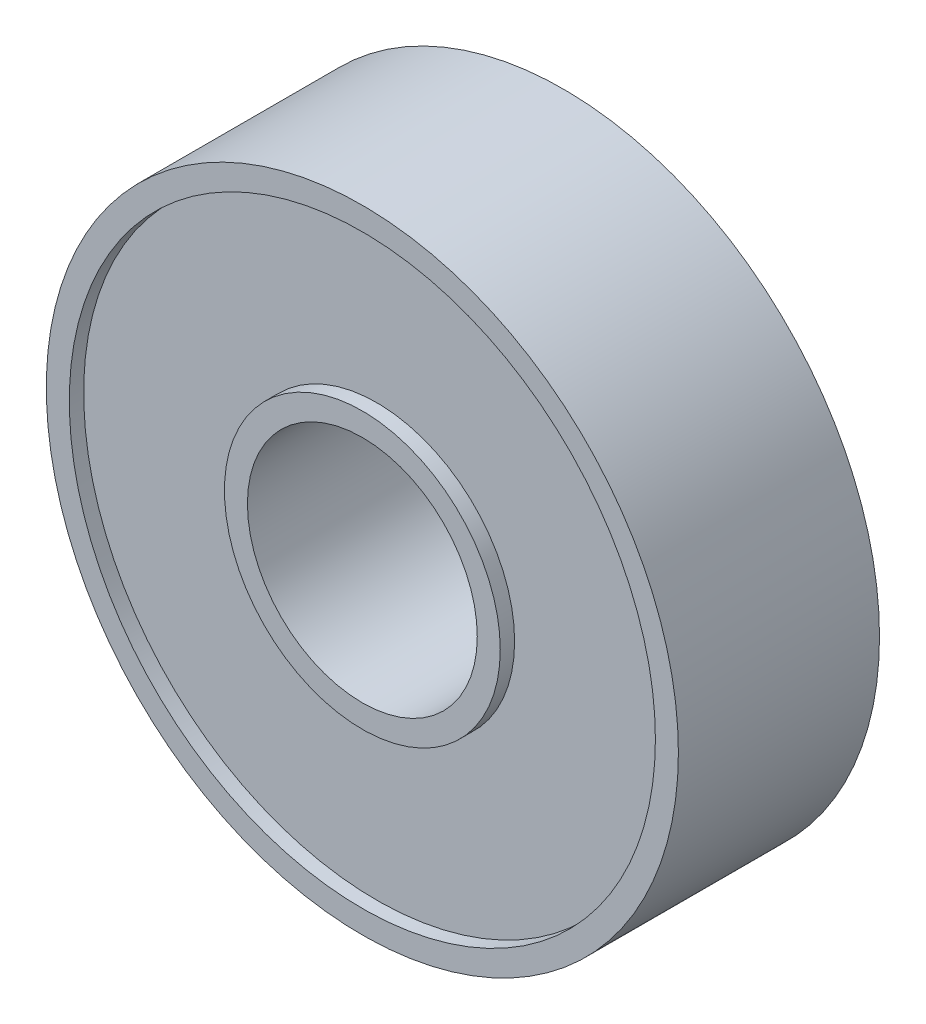
ISO-10303-21;
HEADER;
FILE_DESCRIPTION(('STEP AP214'),'2;1');
FILE_NAME('part.step','',(''),(''),'','','');
FILE_SCHEMA(('AUTOMOTIVE_DESIGN { 1 0 10303 214 1 1 1 1 }'));
ENDSEC;
DATA;
#1=APPLICATION_CONTEXT('core data for automotive mechanical design processes');
#2=APPLICATION_PROTOCOL_DEFINITION('international standard','automotive_design',2000,#1);
#3=PRODUCT_CONTEXT('',#1,'mechanical');
#4=PRODUCT('Part','Part','',(#3));
#5=PRODUCT_RELATED_PRODUCT_CATEGORY('part','',(#4));
#6=PRODUCT_DEFINITION_FORMATION('','',#4);
#7=PRODUCT_DEFINITION_CONTEXT('part definition',#1,'design');
#8=PRODUCT_DEFINITION('design','',#6,#7);
#9=PRODUCT_DEFINITION_SHAPE('','',#8);
#10=(LENGTH_UNIT() NAMED_UNIT(*) SI_UNIT(.MILLI.,.METRE.));
#11=(NAMED_UNIT(*) PLANE_ANGLE_UNIT() SI_UNIT($,.RADIAN.));
#12=(NAMED_UNIT(*) SI_UNIT($,.STERADIAN.) SOLID_ANGLE_UNIT());
#13=UNCERTAINTY_MEASURE_WITH_UNIT(LENGTH_MEASURE(1.E-05),#10,'distance_accuracy_value','');
#14=(GEOMETRIC_REPRESENTATION_CONTEXT(3) GLOBAL_UNCERTAINTY_ASSIGNED_CONTEXT((#13)) GLOBAL_UNIT_ASSIGNED_CONTEXT((#10,
#11,#12)) REPRESENTATION_CONTEXT('',''));
#15=CARTESIAN_POINT('',(0.,0.,0.));
#16=DIRECTION('',(0.,0.,1.));
#17=DIRECTION('',(1.,0.,0.));
#18=AXIS2_PLACEMENT_3D('',#15,#16,#17);
#19=CARTESIAN_POINT('',(0.,0.,4.53807108026857));
#20=DIRECTION('',(0.,0.,1.));
#21=DIRECTION('',(1.,0.,0.));
#22=AXIS2_PLACEMENT_3D('',#19,#20,#21);
#23=CYLINDRICAL_SURFACE('',#22,4.8);
#24=CARTESIAN_POINT('',(0.,0.,3.5));
#25=DIRECTION('',(0.,0.,1.));
#26=DIRECTION('',(1.,0.,0.));
#27=AXIS2_PLACEMENT_3D('',#24,#25,#26);
#28=CIRCLE('',#27,4.8);
#29=CARTESIAN_POINT('',(4.8,0.,3.5));
#30=VERTEX_POINT('',#29);
#31=EDGE_CURVE('E10',#30,#30,#28,.T.);
#32=ORIENTED_EDGE('',*,*,#31,.F.);
#33=EDGE_LOOP('',(#32));
#34=FACE_BOUND('',#33,.T.);
#35=CARTESIAN_POINT('',(0.,0.,3.));
#36=DIRECTION('',(0.,0.,1.));
#37=DIRECTION('',(1.,0.,0.));
#38=AXIS2_PLACEMENT_3D('',#35,#36,#37);
#39=CIRCLE('',#38,4.8);
#40=CARTESIAN_POINT('',(4.8,0.,3.));
#41=VERTEX_POINT('',#40);
#42=EDGE_CURVE('E71',#41,#41,#39,.T.);
#43=ORIENTED_EDGE('',*,*,#42,.T.);
#44=EDGE_LOOP('',(#43));
#45=FACE_BOUND('',#44,.T.);
#46=ADVANCED_FACE('F31',(#34,#45),#23,.T.);
#47=CARTESIAN_POINT('',(0.,4.,3.5));
#48=DIRECTION('',(0.,0.,-1.));
#49=DIRECTION('',(-1.,0.,0.));
#50=AXIS2_PLACEMENT_3D('',#47,#48,#49);
#51=PLANE('',#50);
#52=CARTESIAN_POINT('',(0.,0.,3.5));
#53=DIRECTION('',(0.,0.,1.));
#54=DIRECTION('',(1.,0.,0.));
#55=AXIS2_PLACEMENT_3D('',#52,#53,#54);
#56=CIRCLE('',#55,4.);
#57=CARTESIAN_POINT('',(4.,0.,3.5));
#58=VERTEX_POINT('',#57);
#59=EDGE_CURVE('E37',#58,#58,#56,.T.);
#60=ORIENTED_EDGE('',*,*,#59,.F.);
#61=EDGE_LOOP('',(#60));
#62=FACE_BOUND('',#61,.T.);
#63=ORIENTED_EDGE('',*,*,#31,.T.);
#64=EDGE_LOOP('',(#63));
#65=FACE_BOUND('',#64,.T.);
#66=ADVANCED_FACE('F132',(#62,#65),#51,.F.);
#67=CARTESIAN_POINT('',(0.,0.,4.53807108026857));
#68=DIRECTION('',(0.,0.,1.));
#69=DIRECTION('',(1.,0.,0.));
#70=AXIS2_PLACEMENT_3D('',#67,#68,#69);
#71=CYLINDRICAL_SURFACE('',#70,4.);
#72=CARTESIAN_POINT('',(0.,0.,-3.5));
#73=DIRECTION('',(0.,0.,1.));
#74=DIRECTION('',(1.,0.,0.));
#75=AXIS2_PLACEMENT_3D('',#72,#73,#74);
#76=CIRCLE('',#75,4.);
#77=CARTESIAN_POINT('',(4.,0.,-3.5));
#78=VERTEX_POINT('',#77);
#79=EDGE_CURVE('E41',#78,#78,#76,.T.);
#80=ORIENTED_EDGE('',*,*,#79,.F.);
#81=EDGE_LOOP('',(#80));
#82=FACE_BOUND('',#81,.T.);
#83=ORIENTED_EDGE('',*,*,#59,.T.);
#84=EDGE_LOOP('',(#83));
#85=FACE_BOUND('',#84,.T.);
#86=ADVANCED_FACE('F127',(#82,#85),#71,.F.);
#87=CARTESIAN_POINT('',(0.,4.,-3.5));
#88=DIRECTION('',(0.,0.,1.));
#89=DIRECTION('',(1.,0.,0.));
#90=AXIS2_PLACEMENT_3D('',#87,#88,#89);
#91=PLANE('',#90);
#92=CARTESIAN_POINT('',(0.,0.,-3.5));
#93=DIRECTION('',(0.,0.,1.));
#94=DIRECTION('',(1.,0.,0.));
#95=AXIS2_PLACEMENT_3D('',#92,#93,#94);
#96=CIRCLE('',#95,4.8);
#97=CARTESIAN_POINT('',(4.8,0.,-3.5));
#98=VERTEX_POINT('',#97);
#99=EDGE_CURVE('E45',#98,#98,#96,.T.);
#100=ORIENTED_EDGE('',*,*,#99,.F.);
#101=EDGE_LOOP('',(#100));
#102=FACE_BOUND('',#101,.T.);
#103=ORIENTED_EDGE('',*,*,#79,.T.);
#104=EDGE_LOOP('',(#103));
#105=FACE_BOUND('',#104,.T.);
#106=ADVANCED_FACE('F121',(#102,#105),#91,.F.);
#107=CARTESIAN_POINT('',(0.,0.,4.53807108026857));
#108=DIRECTION('',(0.,0.,1.));
#109=DIRECTION('',(1.,0.,0.));
#110=AXIS2_PLACEMENT_3D('',#107,#108,#109);
#111=CYLINDRICAL_SURFACE('',#110,4.8);
#112=CARTESIAN_POINT('',(0.,0.,-3.));
#113=DIRECTION('',(0.,0.,1.));
#114=DIRECTION('',(1.,0.,0.));
#115=AXIS2_PLACEMENT_3D('',#112,#113,#114);
#116=CIRCLE('',#115,4.8);
#117=CARTESIAN_POINT('',(4.8,0.,-3.));
#118=VERTEX_POINT('',#117);
#119=EDGE_CURVE('E50',#118,#118,#116,.T.);
#120=ORIENTED_EDGE('',*,*,#119,.F.);
#121=EDGE_LOOP('',(#120));
#122=FACE_BOUND('',#121,.T.);
#123=ORIENTED_EDGE('',*,*,#99,.T.);
#124=EDGE_LOOP('',(#123));
#125=FACE_BOUND('',#124,.T.);
#126=ADVANCED_FACE('F115',(#122,#125),#111,.T.);
#127=CARTESIAN_POINT('',(0.,4.8,-3.));
#128=DIRECTION('',(0.,0.,1.));
#129=DIRECTION('',(1.,0.,0.));
#130=AXIS2_PLACEMENT_3D('',#127,#128,#129);
#131=PLANE('',#130);
#132=CARTESIAN_POINT('',(0.,0.,-3.));
#133=DIRECTION('',(0.,0.,1.));
#134=DIRECTION('',(1.,0.,0.));
#135=AXIS2_PLACEMENT_3D('',#132,#133,#134);
#136=CIRCLE('',#135,10.2);
#137=CARTESIAN_POINT('',(10.2,0.,-3.));
#138=VERTEX_POINT('',#137);
#139=EDGE_CURVE('E53',#138,#138,#136,.T.);
#140=ORIENTED_EDGE('',*,*,#139,.F.);
#141=EDGE_LOOP('',(#140));
#142=FACE_BOUND('',#141,.T.);
#143=ORIENTED_EDGE('',*,*,#119,.T.);
#144=EDGE_LOOP('',(#143));
#145=FACE_BOUND('',#144,.T.);
#146=ADVANCED_FACE('F109',(#142,#145),#131,.F.);
#147=CARTESIAN_POINT('',(0.,0.,4.53807108026857));
#148=DIRECTION('',(0.,0.,1.));
#149=DIRECTION('',(1.,0.,0.));
#150=AXIS2_PLACEMENT_3D('',#147,#148,#149);
#151=CYLINDRICAL_SURFACE('',#150,10.2);
#152=CARTESIAN_POINT('',(0.,0.,-3.5));
#153=DIRECTION('',(0.,0.,1.));
#154=DIRECTION('',(1.,0.,0.));
#155=AXIS2_PLACEMENT_3D('',#152,#153,#154);
#156=CIRCLE('',#155,10.2);
#157=CARTESIAN_POINT('',(10.2,0.,-3.5));
#158=VERTEX_POINT('',#157);
#159=EDGE_CURVE('E56',#158,#158,#156,.T.);
#160=ORIENTED_EDGE('',*,*,#159,.F.);
#161=EDGE_LOOP('',(#160));
#162=FACE_BOUND('',#161,.T.);
#163=ORIENTED_EDGE('',*,*,#139,.T.);
#164=EDGE_LOOP('',(#163));
#165=FACE_BOUND('',#164,.T.);
#166=ADVANCED_FACE('F103',(#162,#165),#151,.F.);
#167=CARTESIAN_POINT('',(0.,10.2,-3.5));
#168=DIRECTION('',(0.,0.,1.));
#169=DIRECTION('',(1.,0.,0.));
#170=AXIS2_PLACEMENT_3D('',#167,#168,#169);
#171=PLANE('',#170);
#172=CARTESIAN_POINT('',(0.,0.,-3.5));
#173=DIRECTION('',(0.,0.,1.));
#174=DIRECTION('',(1.,0.,0.));
#175=AXIS2_PLACEMENT_3D('',#172,#173,#174);
#176=CIRCLE('',#175,11.);
#177=CARTESIAN_POINT('',(11.,0.,-3.5));
#178=VERTEX_POINT('',#177);
#179=EDGE_CURVE('E59',#178,#178,#176,.T.);
#180=ORIENTED_EDGE('',*,*,#179,.F.);
#181=EDGE_LOOP('',(#180));
#182=FACE_BOUND('',#181,.T.);
#183=ORIENTED_EDGE('',*,*,#159,.T.);
#184=EDGE_LOOP('',(#183));
#185=FACE_BOUND('',#184,.T.);
#186=ADVANCED_FACE('F97',(#182,#185),#171,.F.);
#187=CARTESIAN_POINT('',(0.,0.,4.53807108026857));
#188=DIRECTION('',(0.,0.,1.));
#189=DIRECTION('',(1.,0.,0.));
#190=AXIS2_PLACEMENT_3D('',#187,#188,#189);
#191=CYLINDRICAL_SURFACE('',#190,11.);
#192=CARTESIAN_POINT('',(0.,0.,3.5));
#193=DIRECTION('',(0.,0.,1.));
#194=DIRECTION('',(1.,0.,0.));
#195=AXIS2_PLACEMENT_3D('',#192,#193,#194);
#196=CIRCLE('',#195,11.);
#197=CARTESIAN_POINT('',(11.,0.,3.5));
#198=VERTEX_POINT('',#197);
#199=EDGE_CURVE('E62',#198,#198,#196,.T.);
#200=ORIENTED_EDGE('',*,*,#199,.F.);
#201=EDGE_LOOP('',(#200));
#202=FACE_BOUND('',#201,.T.);
#203=ORIENTED_EDGE('',*,*,#179,.T.);
#204=EDGE_LOOP('',(#203));
#205=FACE_BOUND('',#204,.T.);
#206=ADVANCED_FACE('F91',(#202,#205),#191,.T.);
#207=CARTESIAN_POINT('',(0.,10.2,3.5));
#208=DIRECTION('',(0.,0.,-1.));
#209=DIRECTION('',(-1.,0.,0.));
#210=AXIS2_PLACEMENT_3D('',#207,#208,#209);
#211=PLANE('',#210);
#212=CARTESIAN_POINT('',(0.,0.,3.5));
#213=DIRECTION('',(0.,0.,1.));
#214=DIRECTION('',(1.,0.,0.));
#215=AXIS2_PLACEMENT_3D('',#212,#213,#214);
#216=CIRCLE('',#215,10.2);
#217=CARTESIAN_POINT('',(10.2,0.,3.5));
#218=VERTEX_POINT('',#217);
#219=EDGE_CURVE('E65',#218,#218,#216,.T.);
#220=ORIENTED_EDGE('',*,*,#219,.F.);
#221=EDGE_LOOP('',(#220));
#222=FACE_BOUND('',#221,.T.);
#223=ORIENTED_EDGE('',*,*,#199,.T.);
#224=EDGE_LOOP('',(#223));
#225=FACE_BOUND('',#224,.T.);
#226=ADVANCED_FACE('F85',(#222,#225),#211,.F.);
#227=CARTESIAN_POINT('',(0.,0.,4.53807108026857));
#228=DIRECTION('',(0.,0.,1.));
#229=DIRECTION('',(1.,0.,0.));
#230=AXIS2_PLACEMENT_3D('',#227,#228,#229);
#231=CYLINDRICAL_SURFACE('',#230,10.2);
#232=CARTESIAN_POINT('',(0.,0.,3.));
#233=DIRECTION('',(0.,0.,1.));
#234=DIRECTION('',(1.,0.,0.));
#235=AXIS2_PLACEMENT_3D('',#232,#233,#234);
#236=CIRCLE('',#235,10.2);
#237=CARTESIAN_POINT('',(10.2,0.,3.));
#238=VERTEX_POINT('',#237);
#239=EDGE_CURVE('E68',#238,#238,#236,.T.);
#240=ORIENTED_EDGE('',*,*,#239,.F.);
#241=EDGE_LOOP('',(#240));
#242=FACE_BOUND('',#241,.T.);
#243=ORIENTED_EDGE('',*,*,#219,.T.);
#244=EDGE_LOOP('',(#243));
#245=FACE_BOUND('',#244,.T.);
#246=ADVANCED_FACE('F79',(#242,#245),#231,.F.);
#247=CARTESIAN_POINT('',(0.,4.8,3.));
#248=DIRECTION('',(0.,0.,-1.));
#249=DIRECTION('',(-1.,0.,0.));
#250=AXIS2_PLACEMENT_3D('',#247,#248,#249);
#251=PLANE('',#250);
#252=ORIENTED_EDGE('',*,*,#42,.F.);
#253=EDGE_LOOP('',(#252));
#254=FACE_BOUND('',#253,.T.);
#255=ORIENTED_EDGE('',*,*,#239,.T.);
#256=EDGE_LOOP('',(#255));
#257=FACE_BOUND('',#256,.T.);
#258=ADVANCED_FACE('F76',(#254,#257),#251,.F.);
#259=CLOSED_SHELL('',(#46,#66,#86,#106,#126,#146,#166,#186,#206,#226,#246,#258));
#260=MANIFOLD_SOLID_BREP('B2',#259);
#261=ADVANCED_BREP_SHAPE_REPRESENTATION('',(#18,#260),#14);
#262=SHAPE_DEFINITION_REPRESENTATION(#9,#261);
ENDSEC;
END-ISO-10303-21;
